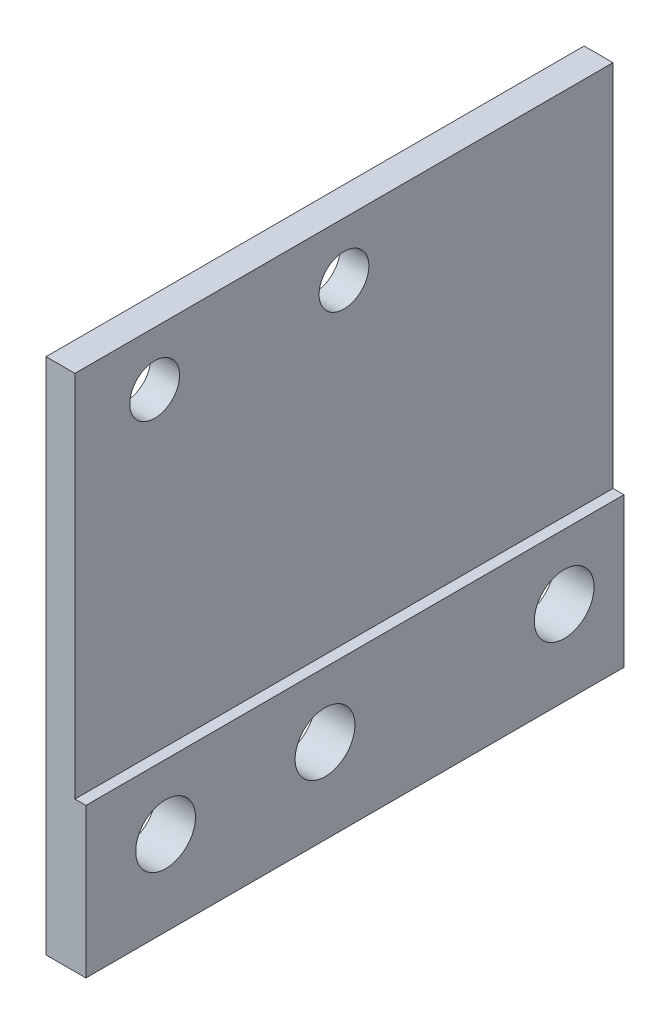
ISO-10303-21;
HEADER;
FILE_DESCRIPTION(('STEP AP214'),'2;1');
FILE_NAME('part.step','',(''),(''),'','','');
FILE_SCHEMA(('AUTOMOTIVE_DESIGN { 1 0 10303 214 1 1 1 1 }'));
ENDSEC;
DATA;
#1=APPLICATION_CONTEXT('core data for automotive mechanical design processes');
#2=APPLICATION_PROTOCOL_DEFINITION('international standard','automotive_design',2000,#1);
#3=PRODUCT_CONTEXT('',#1,'mechanical');
#4=PRODUCT('Part','Part','',(#3));
#5=PRODUCT_RELATED_PRODUCT_CATEGORY('part','',(#4));
#6=PRODUCT_DEFINITION_FORMATION('','',#4);
#7=PRODUCT_DEFINITION_CONTEXT('part definition',#1,'design');
#8=PRODUCT_DEFINITION('design','',#6,#7);
#9=PRODUCT_DEFINITION_SHAPE('','',#8);
#10=(LENGTH_UNIT() NAMED_UNIT(*) SI_UNIT(.MILLI.,.METRE.));
#11=(NAMED_UNIT(*) PLANE_ANGLE_UNIT() SI_UNIT($,.RADIAN.));
#12=(NAMED_UNIT(*) SI_UNIT($,.STERADIAN.) SOLID_ANGLE_UNIT());
#13=UNCERTAINTY_MEASURE_WITH_UNIT(LENGTH_MEASURE(1.E-05),#10,'distance_accuracy_value','');
#14=(GEOMETRIC_REPRESENTATION_CONTEXT(3) GLOBAL_UNCERTAINTY_ASSIGNED_CONTEXT((#13)) GLOBAL_UNIT_ASSIGNED_CONTEXT((#10,
#11,#12)) REPRESENTATION_CONTEXT('',''));
#15=CARTESIAN_POINT('',(0.,0.,0.));
#16=DIRECTION('',(0.,0.,1.));
#17=DIRECTION('',(1.,0.,0.));
#18=AXIS2_PLACEMENT_3D('',#15,#16,#17);
#19=CARTESIAN_POINT('',(0.,7.5,-5.));
#20=DIRECTION('',(-1.,0.,0.));
#21=DIRECTION('',(0.,0.,1.));
#22=AXIS2_PLACEMENT_3D('',#19,#20,#21);
#23=PLANE('',#22);
#24=CARTESIAN_POINT('',(0.,23.2972038265253,18.));
#25=DIRECTION('',(1.,0.,0.));
#26=DIRECTION('',(0.,0.,-1.));
#27=AXIS2_PLACEMENT_3D('',#24,#25,#26);
#28=CIRCLE('',#27,1.25);
#29=CARTESIAN_POINT('',(0.,23.2972038265253,16.75));
#30=VERTEX_POINT('',#29);
#31=EDGE_CURVE('E199',#30,#30,#28,.T.);
#32=ORIENTED_EDGE('',*,*,#31,.T.);
#33=EDGE_LOOP('',(#32));
#34=FACE_BOUND('',#33,.T.);
#35=CARTESIAN_POINT('',(0.,23.2972038265253,8.5));
#36=DIRECTION('',(1.,0.,0.));
#37=DIRECTION('',(0.,0.,-1.));
#38=AXIS2_PLACEMENT_3D('',#35,#36,#37);
#39=CIRCLE('',#38,1.25);
#40=CARTESIAN_POINT('',(0.,23.2972038265253,7.25));
#41=VERTEX_POINT('',#40);
#42=EDGE_CURVE('E193',#41,#41,#39,.T.);
#43=ORIENTED_EDGE('',*,*,#42,.T.);
#44=EDGE_LOOP('',(#43));
#45=FACE_BOUND('',#44,.T.);
#46=CARTESIAN_POINT('',(0.,4.24999999999948,10.));
#47=DIRECTION('',(1.,0.,0.));
#48=DIRECTION('',(0.,0.,-1.));
#49=AXIS2_PLACEMENT_3D('',#46,#47,#48);
#50=CIRCLE('',#49,1.5);
#51=CARTESIAN_POINT('',(0.,4.24999999999948,8.5));
#52=VERTEX_POINT('',#51);
#53=EDGE_CURVE('E189',#52,#52,#50,.T.);
#54=ORIENTED_EDGE('',*,*,#53,.T.);
#55=EDGE_LOOP('',(#54));
#56=FACE_BOUND('',#55,.T.);
#57=CARTESIAN_POINT('',(0.,4.24999999999948,18.));
#58=DIRECTION('',(1.,0.,0.));
#59=DIRECTION('',(0.,0.,-1.));
#60=AXIS2_PLACEMENT_3D('',#57,#58,#59);
#61=CIRCLE('',#60,1.5);
#62=CARTESIAN_POINT('',(0.,4.24999999999948,16.5));
#63=VERTEX_POINT('',#62);
#64=EDGE_CURVE('E184',#63,#63,#61,.T.);
#65=ORIENTED_EDGE('',*,*,#64,.T.);
#66=EDGE_LOOP('',(#65));
#67=FACE_BOUND('',#66,.T.);
#68=CARTESIAN_POINT('',(0.,4.24999999999948,-2.));
#69=DIRECTION('',(1.,0.,0.));
#70=DIRECTION('',(0.,0.,-1.));
#71=AXIS2_PLACEMENT_3D('',#68,#69,#70);
#72=CIRCLE('',#71,1.5);
#73=CARTESIAN_POINT('',(0.,4.24999999999948,-3.5));
#74=VERTEX_POINT('',#73);
#75=EDGE_CURVE('E109',#74,#74,#72,.T.);
#76=ORIENTED_EDGE('',*,*,#75,.T.);
#77=EDGE_LOOP('',(#76));
#78=FACE_BOUND('',#77,.T.);
#79=DIRECTION('',(0.,0.,1.));
#80=VECTOR('',#79,1.);
#81=CARTESIAN_POINT('',(0.,0.,-5.));
#82=LINE('',#81,#80);
#83=CARTESIAN_POINT('',(0.,0.,-5.));
#84=VERTEX_POINT('',#83);
#85=CARTESIAN_POINT('',(0.,0.,22.));
#86=VERTEX_POINT('',#85);
#87=EDGE_CURVE('E41',#84,#86,#82,.T.);
#88=ORIENTED_EDGE('',*,*,#87,.T.);
#89=DIRECTION('',(0.,-1.,0.));
#90=VECTOR('',#89,1.);
#91=CARTESIAN_POINT('',(0.,0.,22.));
#92=LINE('',#91,#90);
#93=CARTESIAN_POINT('',(0.,26.,22.));
#94=VERTEX_POINT('',#93);
#95=EDGE_CURVE('E93',#94,#86,#92,.T.);
#96=ORIENTED_EDGE('',*,*,#95,.F.);
#97=DIRECTION('',(0.,0.,1.));
#98=VECTOR('',#97,1.);
#99=CARTESIAN_POINT('',(0.,26.,-5.));
#100=LINE('',#99,#98);
#101=CARTESIAN_POINT('',(0.,26.,-5.));
#102=VERTEX_POINT('',#101);
#103=EDGE_CURVE('E11',#102,#94,#100,.T.);
#104=ORIENTED_EDGE('',*,*,#103,.F.);
#105=DIRECTION('',(0.,-1.,0.));
#106=VECTOR('',#105,1.);
#107=CARTESIAN_POINT('',(0.,0.,-5.));
#108=LINE('',#107,#106);
#109=EDGE_CURVE('E54',#102,#84,#108,.T.);
#110=ORIENTED_EDGE('',*,*,#109,.T.);
#111=EDGE_LOOP('',(#88,#96,#104,#110));
#112=FACE_BOUND('',#111,.T.);
#113=ADVANCED_FACE('F37',(#34,#45,#56,#67,#78,#112),#23,.T.);
#114=CARTESIAN_POINT('',(0.,26.,-5.));
#115=DIRECTION('',(0.,1.,0.));
#116=DIRECTION('',(0.,0.,1.));
#117=AXIS2_PLACEMENT_3D('',#114,#115,#116);
#118=PLANE('',#117);
#119=ORIENTED_EDGE('',*,*,#103,.T.);
#120=DIRECTION('',(-1.,0.,0.));
#121=VECTOR('',#120,1.);
#122=CARTESIAN_POINT('',(0.,26.,22.));
#123=LINE('',#122,#121);
#124=CARTESIAN_POINT('',(1.45,26.,22.));
#125=VERTEX_POINT('',#124);
#126=EDGE_CURVE('E108',#125,#94,#123,.T.);
#127=ORIENTED_EDGE('',*,*,#126,.F.);
#128=DIRECTION('',(0.,0.,1.));
#129=VECTOR('',#128,1.);
#130=CARTESIAN_POINT('',(1.45,26.,-5.));
#131=LINE('',#130,#129);
#132=CARTESIAN_POINT('',(1.45,26.,-5.));
#133=VERTEX_POINT('',#132);
#134=EDGE_CURVE('E46',#133,#125,#131,.T.);
#135=ORIENTED_EDGE('',*,*,#134,.F.);
#136=DIRECTION('',(-1.,0.,0.));
#137=VECTOR('',#136,1.);
#138=CARTESIAN_POINT('',(0.,26.,-5.));
#139=LINE('',#138,#137);
#140=EDGE_CURVE('E98',#133,#102,#139,.T.);
#141=ORIENTED_EDGE('',*,*,#140,.T.);
#142=EDGE_LOOP('',(#119,#127,#135,#141));
#143=FACE_BOUND('',#142,.T.);
#144=ADVANCED_FACE('F152',(#143),#118,.T.);
#145=CARTESIAN_POINT('',(1.45,7.5,-5.));
#146=DIRECTION('',(1.,0.,0.));
#147=DIRECTION('',(0.,0.,-1.));
#148=AXIS2_PLACEMENT_3D('',#145,#146,#147);
#149=PLANE('',#148);
#150=CARTESIAN_POINT('',(1.45,23.2972038265253,18.));
#151=DIRECTION('',(1.,0.,0.));
#152=DIRECTION('',(0.,0.,-1.));
#153=AXIS2_PLACEMENT_3D('',#150,#151,#152);
#154=CIRCLE('',#153,1.25);
#155=CARTESIAN_POINT('',(1.45,23.2972038265253,16.75));
#156=VERTEX_POINT('',#155);
#157=EDGE_CURVE('E202',#156,#156,#154,.T.);
#158=ORIENTED_EDGE('',*,*,#157,.F.);
#159=EDGE_LOOP('',(#158));
#160=FACE_BOUND('',#159,.T.);
#161=CARTESIAN_POINT('',(1.45,23.2972038265253,8.5));
#162=DIRECTION('',(1.,0.,0.));
#163=DIRECTION('',(0.,0.,-1.));
#164=AXIS2_PLACEMENT_3D('',#161,#162,#163);
#165=CIRCLE('',#164,1.25);
#166=CARTESIAN_POINT('',(1.45,23.2972038265253,7.25));
#167=VERTEX_POINT('',#166);
#168=EDGE_CURVE('E196',#167,#167,#165,.T.);
#169=ORIENTED_EDGE('',*,*,#168,.F.);
#170=EDGE_LOOP('',(#169));
#171=FACE_BOUND('',#170,.T.);
#172=ORIENTED_EDGE('',*,*,#134,.T.);
#173=DIRECTION('',(0.,1.,0.));
#174=VECTOR('',#173,1.);
#175=CARTESIAN_POINT('',(1.45,7.5,22.));
#176=LINE('',#175,#174);
#177=CARTESIAN_POINT('',(1.45,7.5,22.));
#178=VERTEX_POINT('',#177);
#179=EDGE_CURVE('E120',#178,#125,#176,.T.);
#180=ORIENTED_EDGE('',*,*,#179,.F.);
#181=DIRECTION('',(0.,0.,1.));
#182=VECTOR('',#181,1.);
#183=CARTESIAN_POINT('',(1.45,7.5,-5.));
#184=LINE('',#183,#182);
#185=CARTESIAN_POINT('',(1.45,7.5,-5.));
#186=VERTEX_POINT('',#185);
#187=EDGE_CURVE('E137',#186,#178,#184,.T.);
#188=ORIENTED_EDGE('',*,*,#187,.F.);
#189=DIRECTION('',(0.,1.,0.));
#190=VECTOR('',#189,1.);
#191=CARTESIAN_POINT('',(1.45,7.5,-5.));
#192=LINE('',#191,#190);
#193=EDGE_CURVE('E132',#186,#133,#192,.T.);
#194=ORIENTED_EDGE('',*,*,#193,.T.);
#195=EDGE_LOOP('',(#172,#180,#188,#194));
#196=FACE_BOUND('',#195,.T.);
#197=ADVANCED_FACE('F150',(#160,#171,#196),#149,.T.);
#198=CARTESIAN_POINT('',(1.45,7.5,-5.));
#199=DIRECTION('',(0.,1.,0.));
#200=DIRECTION('',(0.,0.,1.));
#201=AXIS2_PLACEMENT_3D('',#198,#199,#200);
#202=PLANE('',#201);
#203=ORIENTED_EDGE('',*,*,#187,.T.);
#204=DIRECTION('',(-1.,0.,0.));
#205=VECTOR('',#204,1.);
#206=CARTESIAN_POINT('',(1.45,7.5,22.));
#207=LINE('',#206,#205);
#208=CARTESIAN_POINT('',(2.,7.5,22.));
#209=VERTEX_POINT('',#208);
#210=EDGE_CURVE('E117',#209,#178,#207,.T.);
#211=ORIENTED_EDGE('',*,*,#210,.F.);
#212=DIRECTION('',(0.,0.,1.));
#213=VECTOR('',#212,1.);
#214=CARTESIAN_POINT('',(2.,7.5,-5.));
#215=LINE('',#214,#213);
#216=CARTESIAN_POINT('',(2.,7.5,-5.));
#217=VERTEX_POINT('',#216);
#218=EDGE_CURVE('E139',#217,#209,#215,.T.);
#219=ORIENTED_EDGE('',*,*,#218,.F.);
#220=DIRECTION('',(-1.,0.,0.));
#221=VECTOR('',#220,1.);
#222=CARTESIAN_POINT('',(1.45,7.5,-5.));
#223=LINE('',#222,#221);
#224=EDGE_CURVE('E129',#217,#186,#223,.T.);
#225=ORIENTED_EDGE('',*,*,#224,.T.);
#226=EDGE_LOOP('',(#203,#211,#219,#225));
#227=FACE_BOUND('',#226,.T.);
#228=ADVANCED_FACE('F147',(#227),#202,.T.);
#229=CARTESIAN_POINT('',(2.,0.,-5.));
#230=DIRECTION('',(1.,0.,0.));
#231=DIRECTION('',(0.,0.,-1.));
#232=AXIS2_PLACEMENT_3D('',#229,#230,#231);
#233=PLANE('',#232);
#234=CARTESIAN_POINT('',(2.,4.24999999999948,10.));
#235=DIRECTION('',(1.,0.,0.));
#236=DIRECTION('',(0.,0.,-1.));
#237=AXIS2_PLACEMENT_3D('',#234,#235,#236);
#238=CIRCLE('',#237,1.5);
#239=CARTESIAN_POINT('',(2.,4.24999999999948,8.5));
#240=VERTEX_POINT('',#239);
#241=EDGE_CURVE('E176',#240,#240,#238,.T.);
#242=ORIENTED_EDGE('',*,*,#241,.F.);
#243=EDGE_LOOP('',(#242));
#244=FACE_BOUND('',#243,.T.);
#245=CARTESIAN_POINT('',(2.,4.24999999999948,18.));
#246=DIRECTION('',(1.,0.,0.));
#247=DIRECTION('',(0.,0.,-1.));
#248=AXIS2_PLACEMENT_3D('',#245,#246,#247);
#249=CIRCLE('',#248,1.5);
#250=CARTESIAN_POINT('',(2.,4.24999999999948,16.5));
#251=VERTEX_POINT('',#250);
#252=EDGE_CURVE('E180',#251,#251,#249,.T.);
#253=ORIENTED_EDGE('',*,*,#252,.F.);
#254=EDGE_LOOP('',(#253));
#255=FACE_BOUND('',#254,.T.);
#256=CARTESIAN_POINT('',(2.,4.24999999999948,-2.));
#257=DIRECTION('',(1.,0.,0.));
#258=DIRECTION('',(0.,0.,-1.));
#259=AXIS2_PLACEMENT_3D('',#256,#257,#258);
#260=CIRCLE('',#259,1.5);
#261=CARTESIAN_POINT('',(2.,4.24999999999948,-3.5));
#262=VERTEX_POINT('',#261);
#263=EDGE_CURVE('E112',#262,#262,#260,.T.);
#264=ORIENTED_EDGE('',*,*,#263,.F.);
#265=EDGE_LOOP('',(#264));
#266=FACE_BOUND('',#265,.T.);
#267=ORIENTED_EDGE('',*,*,#218,.T.);
#268=DIRECTION('',(0.,1.,0.));
#269=VECTOR('',#268,1.);
#270=CARTESIAN_POINT('',(2.,0.,22.));
#271=LINE('',#270,#269);
#272=CARTESIAN_POINT('',(2.,0.,22.));
#273=VERTEX_POINT('',#272);
#274=EDGE_CURVE('E104',#273,#209,#271,.T.);
#275=ORIENTED_EDGE('',*,*,#274,.F.);
#276=DIRECTION('',(0.,0.,1.));
#277=VECTOR('',#276,1.);
#278=CARTESIAN_POINT('',(2.,0.,-5.));
#279=LINE('',#278,#277);
#280=CARTESIAN_POINT('',(2.,0.,-5.));
#281=VERTEX_POINT('',#280);
#282=EDGE_CURVE('E97',#281,#273,#279,.T.);
#283=ORIENTED_EDGE('',*,*,#282,.F.);
#284=DIRECTION('',(0.,1.,0.));
#285=VECTOR('',#284,1.);
#286=CARTESIAN_POINT('',(2.,0.,-5.));
#287=LINE('',#286,#285);
#288=EDGE_CURVE('E126',#281,#217,#287,.T.);
#289=ORIENTED_EDGE('',*,*,#288,.T.);
#290=EDGE_LOOP('',(#267,#275,#283,#289));
#291=FACE_BOUND('',#290,.T.);
#292=ADVANCED_FACE('F141',(#244,#255,#266,#291),#233,.T.);
#293=CARTESIAN_POINT('',(0.,0.,-5.));
#294=DIRECTION('',(0.,-1.,0.));
#295=DIRECTION('',(0.,0.,-1.));
#296=AXIS2_PLACEMENT_3D('',#293,#294,#295);
#297=PLANE('',#296);
#298=ORIENTED_EDGE('',*,*,#282,.T.);
#299=DIRECTION('',(1.,0.,0.));
#300=VECTOR('',#299,1.);
#301=CARTESIAN_POINT('',(0.,0.,22.));
#302=LINE('',#301,#300);
#303=EDGE_CURVE('E100',#86,#273,#302,.T.);
#304=ORIENTED_EDGE('',*,*,#303,.F.);
#305=ORIENTED_EDGE('',*,*,#87,.F.);
#306=DIRECTION('',(1.,0.,0.));
#307=VECTOR('',#306,1.);
#308=CARTESIAN_POINT('',(0.,0.,-5.));
#309=LINE('',#308,#307);
#310=EDGE_CURVE('E124',#84,#281,#309,.T.);
#311=ORIENTED_EDGE('',*,*,#310,.T.);
#312=EDGE_LOOP('',(#298,#304,#305,#311));
#313=FACE_BOUND('',#312,.T.);
#314=ADVANCED_FACE('F39',(#313),#297,.T.);
#315=CARTESIAN_POINT('',(0.,0.,-5.));
#316=DIRECTION('',(0.,0.,-1.));
#317=DIRECTION('',(-1.,0.,0.));
#318=AXIS2_PLACEMENT_3D('',#315,#316,#317);
#319=PLANE('',#318);
#320=ORIENTED_EDGE('',*,*,#109,.F.);
#321=ORIENTED_EDGE('',*,*,#140,.F.);
#322=ORIENTED_EDGE('',*,*,#193,.F.);
#323=ORIENTED_EDGE('',*,*,#224,.F.);
#324=ORIENTED_EDGE('',*,*,#288,.F.);
#325=ORIENTED_EDGE('',*,*,#310,.F.);
#326=EDGE_LOOP('',(#320,#321,#322,#323,#324,#325));
#327=FACE_BOUND('',#326,.T.);
#328=ADVANCED_FACE('F151',(#327),#319,.T.);
#329=CARTESIAN_POINT('',(0.,0.,22.));
#330=DIRECTION('',(0.,0.,-1.));
#331=DIRECTION('',(-1.,0.,0.));
#332=AXIS2_PLACEMENT_3D('',#329,#330,#331);
#333=PLANE('',#332);
#334=ORIENTED_EDGE('',*,*,#95,.T.);
#335=ORIENTED_EDGE('',*,*,#303,.T.);
#336=ORIENTED_EDGE('',*,*,#274,.T.);
#337=ORIENTED_EDGE('',*,*,#210,.T.);
#338=ORIENTED_EDGE('',*,*,#179,.T.);
#339=ORIENTED_EDGE('',*,*,#126,.T.);
#340=EDGE_LOOP('',(#334,#335,#336,#337,#338,#339));
#341=FACE_BOUND('',#340,.T.);
#342=ADVANCED_FACE('F106',(#341),#333,.F.);
#343=CARTESIAN_POINT('',(2.,4.24999999999948,-2.));
#344=DIRECTION('',(1.,0.,0.));
#345=DIRECTION('',(0.,0.,-1.));
#346=AXIS2_PLACEMENT_3D('',#343,#344,#345);
#347=CYLINDRICAL_SURFACE('',#346,1.5);
#348=ORIENTED_EDGE('',*,*,#75,.F.);
#349=EDGE_LOOP('',(#348));
#350=FACE_BOUND('',#349,.T.);
#351=ORIENTED_EDGE('',*,*,#263,.T.);
#352=EDGE_LOOP('',(#351));
#353=FACE_BOUND('',#352,.T.);
#354=ADVANCED_FACE('F228',(#350,#353),#347,.F.);
#355=CARTESIAN_POINT('',(2.,4.24999999999948,18.));
#356=DIRECTION('',(1.,0.,0.));
#357=DIRECTION('',(0.,0.,-1.));
#358=AXIS2_PLACEMENT_3D('',#355,#356,#357);
#359=CYLINDRICAL_SURFACE('',#358,1.5);
#360=ORIENTED_EDGE('',*,*,#64,.F.);
#361=EDGE_LOOP('',(#360));
#362=FACE_BOUND('',#361,.T.);
#363=ORIENTED_EDGE('',*,*,#252,.T.);
#364=EDGE_LOOP('',(#363));
#365=FACE_BOUND('',#364,.T.);
#366=ADVANCED_FACE('F221',(#362,#365),#359,.F.);
#367=CARTESIAN_POINT('',(2.,4.24999999999948,10.));
#368=DIRECTION('',(1.,0.,0.));
#369=DIRECTION('',(0.,0.,-1.));
#370=AXIS2_PLACEMENT_3D('',#367,#368,#369);
#371=CYLINDRICAL_SURFACE('',#370,1.5);
#372=ORIENTED_EDGE('',*,*,#53,.F.);
#373=EDGE_LOOP('',(#372));
#374=FACE_BOUND('',#373,.T.);
#375=ORIENTED_EDGE('',*,*,#241,.T.);
#376=EDGE_LOOP('',(#375));
#377=FACE_BOUND('',#376,.T.);
#378=ADVANCED_FACE('F212',(#374,#377),#371,.F.);
#379=CARTESIAN_POINT('',(1.45,23.2972038265253,8.5));
#380=DIRECTION('',(1.,0.,0.));
#381=DIRECTION('',(0.,0.,-1.));
#382=AXIS2_PLACEMENT_3D('',#379,#380,#381);
#383=CYLINDRICAL_SURFACE('',#382,1.25);
#384=ORIENTED_EDGE('',*,*,#42,.F.);
#385=EDGE_LOOP('',(#384));
#386=FACE_BOUND('',#385,.T.);
#387=ORIENTED_EDGE('',*,*,#168,.T.);
#388=EDGE_LOOP('',(#387));
#389=FACE_BOUND('',#388,.T.);
#390=ADVANCED_FACE('F210',(#386,#389),#383,.F.);
#391=CARTESIAN_POINT('',(1.45,23.2972038265253,18.));
#392=DIRECTION('',(1.,0.,0.));
#393=DIRECTION('',(0.,0.,-1.));
#394=AXIS2_PLACEMENT_3D('',#391,#392,#393);
#395=CYLINDRICAL_SURFACE('',#394,1.25);
#396=ORIENTED_EDGE('',*,*,#31,.F.);
#397=EDGE_LOOP('',(#396));
#398=FACE_BOUND('',#397,.T.);
#399=ORIENTED_EDGE('',*,*,#157,.T.);
#400=EDGE_LOOP('',(#399));
#401=FACE_BOUND('',#400,.T.);
#402=ADVANCED_FACE('F206',(#398,#401),#395,.F.);
#403=CLOSED_SHELL('',(#113,#144,#197,#228,#292,#314,#328,#342,#354,#366,#378,#390,#402));
#404=MANIFOLD_SOLID_BREP('B2',#403);
#405=ADVANCED_BREP_SHAPE_REPRESENTATION('',(#18,#404),#14);
#406=SHAPE_DEFINITION_REPRESENTATION(#9,#405);
ENDSEC;
END-ISO-10303-21;
